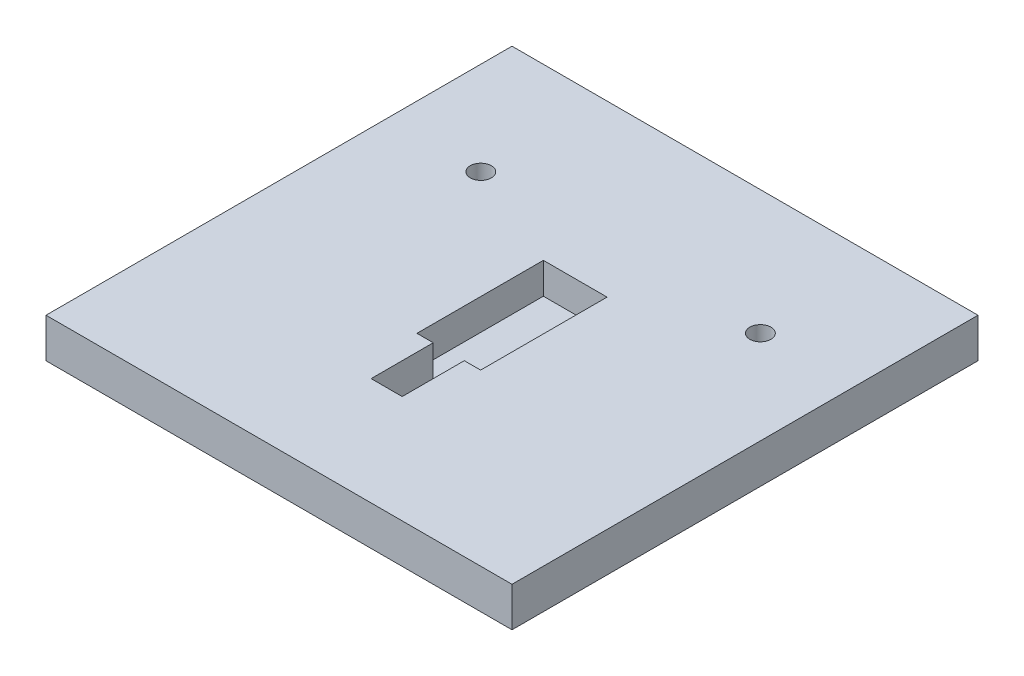
ISO-10303-21;
HEADER;
FILE_DESCRIPTION(('STEP AP214'),'2;1');
FILE_NAME('part.step','',(''),(''),'','','');
FILE_SCHEMA(('AUTOMOTIVE_DESIGN { 1 0 10303 214 1 1 1 1 }'));
ENDSEC;
DATA;
#1=APPLICATION_CONTEXT('core data for automotive mechanical design processes');
#2=APPLICATION_PROTOCOL_DEFINITION('international standard','automotive_design',2000,#1);
#3=PRODUCT_CONTEXT('',#1,'mechanical');
#4=PRODUCT('Part','Part','',(#3));
#5=PRODUCT_RELATED_PRODUCT_CATEGORY('part','',(#4));
#6=PRODUCT_DEFINITION_FORMATION('','',#4);
#7=PRODUCT_DEFINITION_CONTEXT('part definition',#1,'design');
#8=PRODUCT_DEFINITION('design','',#6,#7);
#9=PRODUCT_DEFINITION_SHAPE('','',#8);
#10=(LENGTH_UNIT() NAMED_UNIT(*) SI_UNIT(.MILLI.,.METRE.));
#11=(NAMED_UNIT(*) PLANE_ANGLE_UNIT() SI_UNIT($,.RADIAN.));
#12=(NAMED_UNIT(*) SI_UNIT($,.STERADIAN.) SOLID_ANGLE_UNIT());
#13=UNCERTAINTY_MEASURE_WITH_UNIT(LENGTH_MEASURE(1.E-05),#10,'distance_accuracy_value','');
#14=(GEOMETRIC_REPRESENTATION_CONTEXT(3) GLOBAL_UNCERTAINTY_ASSIGNED_CONTEXT((#13)) GLOBAL_UNIT_ASSIGNED_CONTEXT((#10,
#11,#12)) REPRESENTATION_CONTEXT('',''));
#15=CARTESIAN_POINT('',(0.,0.,0.));
#16=DIRECTION('',(0.,0.,1.));
#17=DIRECTION('',(1.,0.,0.));
#18=AXIS2_PLACEMENT_3D('',#15,#16,#17);
#19=CARTESIAN_POINT('',(-75.,12.7,75.));
#20=DIRECTION('',(1.,0.,0.));
#21=DIRECTION('',(0.,0.,-1.));
#22=AXIS2_PLACEMENT_3D('',#19,#20,#21);
#23=PLANE('',#22);
#24=DIRECTION('',(0.,0.,1.));
#25=VECTOR('',#24,1.);
#26=CARTESIAN_POINT('',(-75.,0.,75.));
#27=LINE('',#26,#25);
#28=CARTESIAN_POINT('',(-75.,0.,-75.));
#29=VERTEX_POINT('',#28);
#30=CARTESIAN_POINT('',(-75.,0.,75.));
#31=VERTEX_POINT('',#30);
#32=EDGE_CURVE('E250',#29,#31,#27,.T.);
#33=ORIENTED_EDGE('',*,*,#32,.T.);
#34=DIRECTION('',(0.,-1.,0.));
#35=VECTOR('',#34,1.);
#36=CARTESIAN_POINT('',(-75.,12.7,75.));
#37=LINE('',#36,#35);
#38=CARTESIAN_POINT('',(-75.,12.7,75.));
#39=VERTEX_POINT('',#38);
#40=EDGE_CURVE('E11',#39,#31,#37,.T.);
#41=ORIENTED_EDGE('',*,*,#40,.F.);
#42=DIRECTION('',(0.,0.,1.));
#43=VECTOR('',#42,1.);
#44=CARTESIAN_POINT('',(-75.,12.7,75.));
#45=LINE('',#44,#43);
#46=CARTESIAN_POINT('',(-75.,12.7,-75.));
#47=VERTEX_POINT('',#46);
#48=EDGE_CURVE('E265',#47,#39,#45,.T.);
#49=ORIENTED_EDGE('',*,*,#48,.F.);
#50=DIRECTION('',(0.,-1.,0.));
#51=VECTOR('',#50,1.);
#52=CARTESIAN_POINT('',(-75.,12.7,-75.));
#53=LINE('',#52,#51);
#54=EDGE_CURVE('E279',#47,#29,#53,.T.);
#55=ORIENTED_EDGE('',*,*,#54,.T.);
#56=EDGE_LOOP('',(#33,#41,#49,#55));
#57=FACE_BOUND('',#56,.T.);
#58=ADVANCED_FACE('F42',(#57),#23,.F.);
#59=CARTESIAN_POINT('',(75.,12.7,75.));
#60=DIRECTION('',(0.,0.,-1.));
#61=DIRECTION('',(-1.,0.,0.));
#62=AXIS2_PLACEMENT_3D('',#59,#60,#61);
#63=PLANE('',#62);
#64=DIRECTION('',(1.,0.,0.));
#65=VECTOR('',#64,1.);
#66=CARTESIAN_POINT('',(75.,0.,75.));
#67=LINE('',#66,#65);
#68=CARTESIAN_POINT('',(75.,0.,75.));
#69=VERTEX_POINT('',#68);
#70=EDGE_CURVE('E283',#31,#69,#67,.T.);
#71=ORIENTED_EDGE('',*,*,#70,.T.);
#72=DIRECTION('',(0.,-1.,0.));
#73=VECTOR('',#72,1.);
#74=CARTESIAN_POINT('',(75.,12.7,75.));
#75=LINE('',#74,#73);
#76=CARTESIAN_POINT('',(75.,12.7,75.));
#77=VERTEX_POINT('',#76);
#78=EDGE_CURVE('E50',#77,#69,#75,.T.);
#79=ORIENTED_EDGE('',*,*,#78,.F.);
#80=DIRECTION('',(1.,0.,0.));
#81=VECTOR('',#80,1.);
#82=CARTESIAN_POINT('',(75.,12.7,75.));
#83=LINE('',#82,#81);
#84=EDGE_CURVE('E269',#39,#77,#83,.T.);
#85=ORIENTED_EDGE('',*,*,#84,.F.);
#86=ORIENTED_EDGE('',*,*,#40,.T.);
#87=EDGE_LOOP('',(#71,#79,#85,#86));
#88=FACE_BOUND('',#87,.T.);
#89=ADVANCED_FACE('F317',(#88),#63,.F.);
#90=CARTESIAN_POINT('',(75.,12.7,75.));
#91=DIRECTION('',(-1.,0.,0.));
#92=DIRECTION('',(0.,0.,1.));
#93=AXIS2_PLACEMENT_3D('',#90,#91,#92);
#94=PLANE('',#93);
#95=DIRECTION('',(0.,0.,-1.));
#96=VECTOR('',#95,1.);
#97=CARTESIAN_POINT('',(75.,0.,75.));
#98=LINE('',#97,#96);
#99=CARTESIAN_POINT('',(75.,0.,-75.));
#100=VERTEX_POINT('',#99);
#101=EDGE_CURVE('E286',#69,#100,#98,.T.);
#102=ORIENTED_EDGE('',*,*,#101,.T.);
#103=DIRECTION('',(0.,-1.,0.));
#104=VECTOR('',#103,1.);
#105=CARTESIAN_POINT('',(75.,12.7,-75.));
#106=LINE('',#105,#104);
#107=CARTESIAN_POINT('',(75.,12.7,-75.));
#108=VERTEX_POINT('',#107);
#109=EDGE_CURVE('E294',#108,#100,#106,.T.);
#110=ORIENTED_EDGE('',*,*,#109,.F.);
#111=DIRECTION('',(0.,0.,-1.));
#112=VECTOR('',#111,1.);
#113=CARTESIAN_POINT('',(75.,12.7,75.));
#114=LINE('',#113,#112);
#115=EDGE_CURVE('E273',#77,#108,#114,.T.);
#116=ORIENTED_EDGE('',*,*,#115,.F.);
#117=ORIENTED_EDGE('',*,*,#78,.T.);
#118=EDGE_LOOP('',(#102,#110,#116,#117));
#119=FACE_BOUND('',#118,.T.);
#120=ADVANCED_FACE('F303',(#119),#94,.F.);
#121=CARTESIAN_POINT('',(75.,12.7,-75.));
#122=DIRECTION('',(0.,0.,1.));
#123=DIRECTION('',(1.,0.,0.));
#124=AXIS2_PLACEMENT_3D('',#121,#122,#123);
#125=PLANE('',#124);
#126=DIRECTION('',(-1.,0.,0.));
#127=VECTOR('',#126,1.);
#128=CARTESIAN_POINT('',(75.,0.,-75.));
#129=LINE('',#128,#127);
#130=EDGE_CURVE('E270',#100,#29,#129,.T.);
#131=ORIENTED_EDGE('',*,*,#130,.T.);
#132=ORIENTED_EDGE('',*,*,#54,.F.);
#133=DIRECTION('',(-1.,0.,0.));
#134=VECTOR('',#133,1.);
#135=CARTESIAN_POINT('',(75.,12.7,-75.));
#136=LINE('',#135,#134);
#137=EDGE_CURVE('E276',#108,#47,#136,.T.);
#138=ORIENTED_EDGE('',*,*,#137,.F.);
#139=ORIENTED_EDGE('',*,*,#109,.T.);
#140=EDGE_LOOP('',(#131,#132,#138,#139));
#141=FACE_BOUND('',#140,.T.);
#142=ADVANCED_FACE('F310',(#141),#125,.F.);
#143=CARTESIAN_POINT('',(0.,12.7,0.));
#144=DIRECTION('',(0.,1.,0.));
#145=DIRECTION('',(0.,0.,1.));
#146=AXIS2_PLACEMENT_3D('',#143,#144,#145);
#147=PLANE('',#146);
#148=CARTESIAN_POINT('',(45.,12.7,-34.96));
#149=DIRECTION('',(0.,1.,0.));
#150=DIRECTION('',(0.,0.,1.));
#151=AXIS2_PLACEMENT_3D('',#148,#149,#150);
#152=CIRCLE('',#151,3.39999999999999);
#153=CARTESIAN_POINT('',(45.,12.7,-31.56));
#154=VERTEX_POINT('',#153);
#155=EDGE_CURVE('E382',#154,#154,#152,.T.);
#156=ORIENTED_EDGE('',*,*,#155,.F.);
#157=EDGE_LOOP('',(#156));
#158=FACE_BOUND('',#157,.T.);
#159=CARTESIAN_POINT('',(-45.,12.7,-34.96));
#160=DIRECTION('',(0.,1.,0.));
#161=DIRECTION('',(0.,0.,1.));
#162=AXIS2_PLACEMENT_3D('',#159,#160,#161);
#163=CIRCLE('',#162,3.39999999999999);
#164=CARTESIAN_POINT('',(-45.,12.7,-31.56));
#165=VERTEX_POINT('',#164);
#166=EDGE_CURVE('E386',#165,#165,#163,.T.);
#167=ORIENTED_EDGE('',*,*,#166,.F.);
#168=EDGE_LOOP('',(#167));
#169=FACE_BOUND('',#168,.T.);
#170=DIRECTION('',(1.,0.,0.));
#171=VECTOR('',#170,1.);
#172=CARTESIAN_POINT('',(-5.,12.7,40.35));
#173=LINE('',#172,#171);
#174=CARTESIAN_POINT('',(-5.,12.7,40.35));
#175=VERTEX_POINT('',#174);
#176=CARTESIAN_POINT('',(5.,12.7,40.35));
#177=VERTEX_POINT('',#176);
#178=EDGE_CURVE('E170',#175,#177,#173,.T.);
#179=ORIENTED_EDGE('',*,*,#178,.F.);
#180=DIRECTION('',(0.,0.,1.));
#181=VECTOR('',#180,1.);
#182=CARTESIAN_POINT('',(-5.,12.7,20.35));
#183=LINE('',#182,#181);
#184=CARTESIAN_POINT('',(-5.,12.7,20.35));
#185=VERTEX_POINT('',#184);
#186=EDGE_CURVE('E152',#185,#175,#183,.T.);
#187=ORIENTED_EDGE('',*,*,#186,.F.);
#188=DIRECTION('',(1.,0.,0.));
#189=VECTOR('',#188,1.);
#190=CARTESIAN_POINT('',(-10.25,12.7,20.35));
#191=LINE('',#190,#189);
#192=CARTESIAN_POINT('',(-10.25,12.7,20.35));
#193=VERTEX_POINT('',#192);
#194=EDGE_CURVE('E226',#193,#185,#191,.T.);
#195=ORIENTED_EDGE('',*,*,#194,.F.);
#196=DIRECTION('',(0.,0.,1.));
#197=VECTOR('',#196,1.);
#198=CARTESIAN_POINT('',(-10.25,12.7,20.35));
#199=LINE('',#198,#197);
#200=CARTESIAN_POINT('',(-10.25,12.7,-20.35));
#201=VERTEX_POINT('',#200);
#202=EDGE_CURVE('E65',#201,#193,#199,.T.);
#203=ORIENTED_EDGE('',*,*,#202,.F.);
#204=DIRECTION('',(-1.,0.,0.));
#205=VECTOR('',#204,1.);
#206=CARTESIAN_POINT('',(10.25,12.7,-20.35));
#207=LINE('',#206,#205);
#208=CARTESIAN_POINT('',(10.25,12.7,-20.35));
#209=VERTEX_POINT('',#208);
#210=EDGE_CURVE('E195',#209,#201,#207,.T.);
#211=ORIENTED_EDGE('',*,*,#210,.F.);
#212=DIRECTION('',(0.,0.,-1.));
#213=VECTOR('',#212,1.);
#214=CARTESIAN_POINT('',(10.25,12.7,20.35));
#215=LINE('',#214,#213);
#216=CARTESIAN_POINT('',(10.25,12.7,20.35));
#217=VERTEX_POINT('',#216);
#218=EDGE_CURVE('E240',#217,#209,#215,.T.);
#219=ORIENTED_EDGE('',*,*,#218,.F.);
#220=DIRECTION('',(1.,0.,0.));
#221=VECTOR('',#220,1.);
#222=CARTESIAN_POINT('',(5.,12.7,20.35));
#223=LINE('',#222,#221);
#224=CARTESIAN_POINT('',(5.,12.7,20.35));
#225=VERTEX_POINT('',#224);
#226=EDGE_CURVE('E236',#225,#217,#223,.T.);
#227=ORIENTED_EDGE('',*,*,#226,.F.);
#228=DIRECTION('',(0.,0.,-1.));
#229=VECTOR('',#228,1.);
#230=CARTESIAN_POINT('',(5.,12.7,20.35));
#231=LINE('',#230,#229);
#232=EDGE_CURVE('E232',#177,#225,#231,.T.);
#233=ORIENTED_EDGE('',*,*,#232,.F.);
#234=EDGE_LOOP('',(#179,#187,#195,#203,#211,#219,#227,#233));
#235=FACE_BOUND('',#234,.T.);
#236=ORIENTED_EDGE('',*,*,#48,.T.);
#237=ORIENTED_EDGE('',*,*,#84,.T.);
#238=ORIENTED_EDGE('',*,*,#115,.T.);
#239=ORIENTED_EDGE('',*,*,#137,.T.);
#240=EDGE_LOOP('',(#236,#237,#238,#239));
#241=FACE_BOUND('',#240,.T.);
#242=ADVANCED_FACE('F316',(#158,#169,#235,#241),#147,.T.);
#243=CARTESIAN_POINT('',(0.,0.,0.));
#244=DIRECTION('',(0.,1.,0.));
#245=DIRECTION('',(0.,0.,1.));
#246=AXIS2_PLACEMENT_3D('',#243,#244,#245);
#247=PLANE('',#246);
#248=CARTESIAN_POINT('',(45.,0.,-34.96));
#249=DIRECTION('',(0.,1.,0.));
#250=DIRECTION('',(0.,0.,1.));
#251=AXIS2_PLACEMENT_3D('',#248,#249,#250);
#252=CIRCLE('',#251,3.39999999999999);
#253=CARTESIAN_POINT('',(45.,0.,-31.56));
#254=VERTEX_POINT('',#253);
#255=EDGE_CURVE('E379',#254,#254,#252,.T.);
#256=ORIENTED_EDGE('',*,*,#255,.T.);
#257=EDGE_LOOP('',(#256));
#258=FACE_BOUND('',#257,.T.);
#259=CARTESIAN_POINT('',(-45.,0.,-34.96));
#260=DIRECTION('',(0.,1.,0.));
#261=DIRECTION('',(0.,0.,1.));
#262=AXIS2_PLACEMENT_3D('',#259,#260,#261);
#263=CIRCLE('',#262,3.39999999999999);
#264=CARTESIAN_POINT('',(-45.,0.,-31.56));
#265=VERTEX_POINT('',#264);
#266=EDGE_CURVE('E173',#265,#265,#263,.T.);
#267=ORIENTED_EDGE('',*,*,#266,.T.);
#268=EDGE_LOOP('',(#267));
#269=FACE_BOUND('',#268,.T.);
#270=DIRECTION('',(-1.,0.,0.));
#271=VECTOR('',#270,1.);
#272=CARTESIAN_POINT('',(-5.,0.,30.35));
#273=LINE('',#272,#271);
#274=CARTESIAN_POINT('',(5.,0.,30.35));
#275=VERTEX_POINT('',#274);
#276=CARTESIAN_POINT('',(-5.,0.,30.35));
#277=VERTEX_POINT('',#276);
#278=EDGE_CURVE('E158',#275,#277,#273,.T.);
#279=ORIENTED_EDGE('',*,*,#278,.T.);
#280=DIRECTION('',(0.,0.,1.));
#281=VECTOR('',#280,1.);
#282=CARTESIAN_POINT('',(-5.,0.,30.35));
#283=LINE('',#282,#281);
#284=CARTESIAN_POINT('',(-5.,0.,40.35));
#285=VERTEX_POINT('',#284);
#286=EDGE_CURVE('E149',#277,#285,#283,.T.);
#287=ORIENTED_EDGE('',*,*,#286,.T.);
#288=DIRECTION('',(1.,0.,0.));
#289=VECTOR('',#288,1.);
#290=CARTESIAN_POINT('',(-5.,0.,40.35));
#291=LINE('',#290,#289);
#292=CARTESIAN_POINT('',(5.,0.,40.35));
#293=VERTEX_POINT('',#292);
#294=EDGE_CURVE('E161',#285,#293,#291,.T.);
#295=ORIENTED_EDGE('',*,*,#294,.T.);
#296=DIRECTION('',(0.,0.,-1.));
#297=VECTOR('',#296,1.);
#298=CARTESIAN_POINT('',(5.,0.,30.35));
#299=LINE('',#298,#297);
#300=EDGE_CURVE('E57',#293,#275,#299,.T.);
#301=ORIENTED_EDGE('',*,*,#300,.T.);
#302=EDGE_LOOP('',(#279,#287,#295,#301));
#303=FACE_BOUND('',#302,.T.);
#304=ORIENTED_EDGE('',*,*,#32,.F.);
#305=ORIENTED_EDGE('',*,*,#130,.F.);
#306=ORIENTED_EDGE('',*,*,#101,.F.);
#307=ORIENTED_EDGE('',*,*,#70,.F.);
#308=EDGE_LOOP('',(#304,#305,#306,#307));
#309=FACE_BOUND('',#308,.T.);
#310=ADVANCED_FACE('F166',(#258,#269,#303,#309),#247,.F.);
#311=CARTESIAN_POINT('',(-10.25,2.7,20.35));
#312=DIRECTION('',(-1.,0.,0.));
#313=DIRECTION('',(0.,0.,1.));
#314=AXIS2_PLACEMENT_3D('',#311,#312,#313);
#315=PLANE('',#314);
#316=ORIENTED_EDGE('',*,*,#202,.T.);
#317=DIRECTION('',(0.,1.,0.));
#318=VECTOR('',#317,1.);
#319=CARTESIAN_POINT('',(-10.25,2.7,20.35));
#320=LINE('',#319,#318);
#321=CARTESIAN_POINT('',(-10.25,2.7,20.35));
#322=VERTEX_POINT('',#321);
#323=EDGE_CURVE('E223',#322,#193,#320,.T.);
#324=ORIENTED_EDGE('',*,*,#323,.F.);
#325=DIRECTION('',(0.,0.,1.));
#326=VECTOR('',#325,1.);
#327=CARTESIAN_POINT('',(-10.25,2.7,20.35));
#328=LINE('',#327,#326);
#329=CARTESIAN_POINT('',(-10.25,2.7,-20.35));
#330=VERTEX_POINT('',#329);
#331=EDGE_CURVE('E190',#330,#322,#328,.T.);
#332=ORIENTED_EDGE('',*,*,#331,.F.);
#333=DIRECTION('',(0.,1.,0.));
#334=VECTOR('',#333,1.);
#335=CARTESIAN_POINT('',(-10.25,2.7,-20.35));
#336=LINE('',#335,#334);
#337=EDGE_CURVE('E247',#330,#201,#336,.T.);
#338=ORIENTED_EDGE('',*,*,#337,.T.);
#339=EDGE_LOOP('',(#316,#324,#332,#338));
#340=FACE_BOUND('',#339,.T.);
#341=ADVANCED_FACE('F329',(#340),#315,.F.);
#342=CARTESIAN_POINT('',(10.25,2.7,-20.35));
#343=DIRECTION('',(0.,0.,-1.));
#344=DIRECTION('',(-1.,0.,0.));
#345=AXIS2_PLACEMENT_3D('',#342,#343,#344);
#346=PLANE('',#345);
#347=ORIENTED_EDGE('',*,*,#210,.T.);
#348=ORIENTED_EDGE('',*,*,#337,.F.);
#349=DIRECTION('',(-1.,0.,0.));
#350=VECTOR('',#349,1.);
#351=CARTESIAN_POINT('',(10.25,2.7,-20.35));
#352=LINE('',#351,#350);
#353=CARTESIAN_POINT('',(10.25,2.7,-20.35));
#354=VERTEX_POINT('',#353);
#355=EDGE_CURVE('E219',#354,#330,#352,.T.);
#356=ORIENTED_EDGE('',*,*,#355,.F.);
#357=DIRECTION('',(0.,1.,0.));
#358=VECTOR('',#357,1.);
#359=CARTESIAN_POINT('',(10.25,2.7,-20.35));
#360=LINE('',#359,#358);
#361=EDGE_CURVE('E251',#354,#209,#360,.T.);
#362=ORIENTED_EDGE('',*,*,#361,.T.);
#363=EDGE_LOOP('',(#347,#348,#356,#362));
#364=FACE_BOUND('',#363,.T.);
#365=ADVANCED_FACE('F336',(#364),#346,.F.);
#366=CARTESIAN_POINT('',(10.25,2.7,20.35));
#367=DIRECTION('',(1.,0.,0.));
#368=DIRECTION('',(0.,0.,-1.));
#369=AXIS2_PLACEMENT_3D('',#366,#367,#368);
#370=PLANE('',#369);
#371=ORIENTED_EDGE('',*,*,#218,.T.);
#372=ORIENTED_EDGE('',*,*,#361,.F.);
#373=DIRECTION('',(0.,0.,-1.));
#374=VECTOR('',#373,1.);
#375=CARTESIAN_POINT('',(10.25,2.7,20.35));
#376=LINE('',#375,#374);
#377=CARTESIAN_POINT('',(10.25,2.7,20.35));
#378=VERTEX_POINT('',#377);
#379=EDGE_CURVE('E215',#378,#354,#376,.T.);
#380=ORIENTED_EDGE('',*,*,#379,.F.);
#381=DIRECTION('',(0.,1.,0.));
#382=VECTOR('',#381,1.);
#383=CARTESIAN_POINT('',(10.25,2.7,20.35));
#384=LINE('',#383,#382);
#385=EDGE_CURVE('E254',#378,#217,#384,.T.);
#386=ORIENTED_EDGE('',*,*,#385,.T.);
#387=EDGE_LOOP('',(#371,#372,#380,#386));
#388=FACE_BOUND('',#387,.T.);
#389=ADVANCED_FACE('F350',(#388),#370,.F.);
#390=CARTESIAN_POINT('',(5.,2.7,20.35));
#391=DIRECTION('',(0.,0.,1.));
#392=DIRECTION('',(1.,0.,0.));
#393=AXIS2_PLACEMENT_3D('',#390,#391,#392);
#394=PLANE('',#393);
#395=ORIENTED_EDGE('',*,*,#226,.T.);
#396=ORIENTED_EDGE('',*,*,#385,.F.);
#397=DIRECTION('',(1.,0.,0.));
#398=VECTOR('',#397,1.);
#399=CARTESIAN_POINT('',(5.,2.7,20.35));
#400=LINE('',#399,#398);
#401=CARTESIAN_POINT('',(5.,2.7,20.35));
#402=VERTEX_POINT('',#401);
#403=EDGE_CURVE('E211',#402,#378,#400,.T.);
#404=ORIENTED_EDGE('',*,*,#403,.F.);
#405=DIRECTION('',(0.,1.,0.));
#406=VECTOR('',#405,1.);
#407=CARTESIAN_POINT('',(5.,2.7,20.35));
#408=LINE('',#407,#406);
#409=EDGE_CURVE('E257',#402,#225,#408,.T.);
#410=ORIENTED_EDGE('',*,*,#409,.T.);
#411=EDGE_LOOP('',(#395,#396,#404,#410));
#412=FACE_BOUND('',#411,.T.);
#413=ADVANCED_FACE('F347',(#412),#394,.F.);
#414=CARTESIAN_POINT('',(5.,2.7,20.35));
#415=DIRECTION('',(1.,0.,0.));
#416=DIRECTION('',(0.,0.,-1.));
#417=AXIS2_PLACEMENT_3D('',#414,#415,#416);
#418=PLANE('',#417);
#419=ORIENTED_EDGE('',*,*,#232,.T.);
#420=ORIENTED_EDGE('',*,*,#409,.F.);
#421=DIRECTION('',(0.,0.,-1.));
#422=VECTOR('',#421,1.);
#423=CARTESIAN_POINT('',(5.,2.7,20.35));
#424=LINE('',#423,#422);
#425=CARTESIAN_POINT('',(5.,2.7,30.35));
#426=VERTEX_POINT('',#425);
#427=EDGE_CURVE('E207',#426,#402,#424,.T.);
#428=ORIENTED_EDGE('',*,*,#427,.F.);
#429=DIRECTION('',(0.,1.,0.));
#430=VECTOR('',#429,1.);
#431=CARTESIAN_POINT('',(5.,0.,30.35));
#432=LINE('',#431,#430);
#433=EDGE_CURVE('E185',#275,#426,#432,.T.);
#434=ORIENTED_EDGE('',*,*,#433,.F.);
#435=ORIENTED_EDGE('',*,*,#300,.F.);
#436=DIRECTION('',(0.,1.,0.));
#437=VECTOR('',#436,1.);
#438=CARTESIAN_POINT('',(5.,0.,40.35));
#439=LINE('',#438,#437);
#440=EDGE_CURVE('E157',#293,#177,#439,.T.);
#441=ORIENTED_EDGE('',*,*,#440,.T.);
#442=EDGE_LOOP('',(#419,#420,#428,#434,#435,#441));
#443=FACE_BOUND('',#442,.T.);
#444=ADVANCED_FACE('F344',(#443),#418,.F.);
#445=CARTESIAN_POINT('',(-5.,2.7,20.35));
#446=DIRECTION('',(-1.,0.,0.));
#447=DIRECTION('',(0.,0.,1.));
#448=AXIS2_PLACEMENT_3D('',#445,#446,#447);
#449=PLANE('',#448);
#450=ORIENTED_EDGE('',*,*,#186,.T.);
#451=DIRECTION('',(0.,1.,0.));
#452=VECTOR('',#451,1.);
#453=CARTESIAN_POINT('',(-5.,0.,40.35));
#454=LINE('',#453,#452);
#455=EDGE_CURVE('E144',#285,#175,#454,.T.);
#456=ORIENTED_EDGE('',*,*,#455,.F.);
#457=ORIENTED_EDGE('',*,*,#286,.F.);
#458=DIRECTION('',(0.,1.,0.));
#459=VECTOR('',#458,1.);
#460=CARTESIAN_POINT('',(-5.,0.,30.35));
#461=LINE('',#460,#459);
#462=CARTESIAN_POINT('',(-5.,2.7,30.35));
#463=VERTEX_POINT('',#462);
#464=EDGE_CURVE('E182',#277,#463,#461,.T.);
#465=ORIENTED_EDGE('',*,*,#464,.T.);
#466=DIRECTION('',(0.,0.,1.));
#467=VECTOR('',#466,1.);
#468=CARTESIAN_POINT('',(-5.,2.7,20.35));
#469=LINE('',#468,#467);
#470=CARTESIAN_POINT('',(-5.,2.7,20.35));
#471=VERTEX_POINT('',#470);
#472=EDGE_CURVE('E199',#471,#463,#469,.T.);
#473=ORIENTED_EDGE('',*,*,#472,.F.);
#474=DIRECTION('',(0.,1.,0.));
#475=VECTOR('',#474,1.);
#476=CARTESIAN_POINT('',(-5.,2.7,20.35));
#477=LINE('',#476,#475);
#478=EDGE_CURVE('E260',#471,#185,#477,.T.);
#479=ORIENTED_EDGE('',*,*,#478,.T.);
#480=EDGE_LOOP('',(#450,#456,#457,#465,#473,#479));
#481=FACE_BOUND('',#480,.T.);
#482=ADVANCED_FACE('F146',(#481),#449,.F.);
#483=CARTESIAN_POINT('',(-10.25,2.7,20.35));
#484=DIRECTION('',(0.,0.,1.));
#485=DIRECTION('',(1.,0.,0.));
#486=AXIS2_PLACEMENT_3D('',#483,#484,#485);
#487=PLANE('',#486);
#488=ORIENTED_EDGE('',*,*,#194,.T.);
#489=ORIENTED_EDGE('',*,*,#478,.F.);
#490=DIRECTION('',(1.,0.,0.));
#491=VECTOR('',#490,1.);
#492=CARTESIAN_POINT('',(-10.25,2.7,20.35));
#493=LINE('',#492,#491);
#494=EDGE_CURVE('E194',#322,#471,#493,.T.);
#495=ORIENTED_EDGE('',*,*,#494,.F.);
#496=ORIENTED_EDGE('',*,*,#323,.T.);
#497=EDGE_LOOP('',(#488,#489,#495,#496));
#498=FACE_BOUND('',#497,.T.);
#499=ADVANCED_FACE('F337',(#498),#487,.F.);
#500=CARTESIAN_POINT('',(0.,2.7,0.));
#501=DIRECTION('',(0.,1.,0.));
#502=DIRECTION('',(0.,0.,1.));
#503=AXIS2_PLACEMENT_3D('',#500,#501,#502);
#504=PLANE('',#503);
#505=ORIENTED_EDGE('',*,*,#331,.T.);
#506=ORIENTED_EDGE('',*,*,#494,.T.);
#507=ORIENTED_EDGE('',*,*,#472,.T.);
#508=DIRECTION('',(1.,0.,0.));
#509=VECTOR('',#508,1.);
#510=CARTESIAN_POINT('',(-5.,2.7,30.35));
#511=LINE('',#510,#509);
#512=EDGE_CURVE('E203',#463,#426,#511,.T.);
#513=ORIENTED_EDGE('',*,*,#512,.T.);
#514=ORIENTED_EDGE('',*,*,#427,.T.);
#515=ORIENTED_EDGE('',*,*,#403,.T.);
#516=ORIENTED_EDGE('',*,*,#379,.T.);
#517=ORIENTED_EDGE('',*,*,#355,.T.);
#518=EDGE_LOOP('',(#505,#506,#507,#513,#514,#515,#516,#517));
#519=FACE_BOUND('',#518,.T.);
#520=ADVANCED_FACE('F340',(#519),#504,.T.);
#521=CARTESIAN_POINT('',(-5.,0.,30.35));
#522=DIRECTION('',(0.,0.,-1.));
#523=DIRECTION('',(-1.,0.,0.));
#524=AXIS2_PLACEMENT_3D('',#521,#522,#523);
#525=PLANE('',#524);
#526=ORIENTED_EDGE('',*,*,#512,.F.);
#527=ORIENTED_EDGE('',*,*,#464,.F.);
#528=ORIENTED_EDGE('',*,*,#278,.F.);
#529=ORIENTED_EDGE('',*,*,#433,.T.);
#530=EDGE_LOOP('',(#526,#527,#528,#529));
#531=FACE_BOUND('',#530,.T.);
#532=ADVANCED_FACE('F360',(#531),#525,.F.);
#533=CARTESIAN_POINT('',(-5.,0.,40.35));
#534=DIRECTION('',(0.,0.,1.));
#535=DIRECTION('',(1.,0.,0.));
#536=AXIS2_PLACEMENT_3D('',#533,#534,#535);
#537=PLANE('',#536);
#538=ORIENTED_EDGE('',*,*,#178,.T.);
#539=ORIENTED_EDGE('',*,*,#440,.F.);
#540=ORIENTED_EDGE('',*,*,#294,.F.);
#541=ORIENTED_EDGE('',*,*,#455,.T.);
#542=EDGE_LOOP('',(#538,#539,#540,#541));
#543=FACE_BOUND('',#542,.T.);
#544=ADVANCED_FACE('F162',(#543),#537,.F.);
#545=CARTESIAN_POINT('',(-45.,12.7,-34.96));
#546=DIRECTION('',(0.,1.,0.));
#547=DIRECTION('',(0.,0.,1.));
#548=AXIS2_PLACEMENT_3D('',#545,#546,#547);
#549=CYLINDRICAL_SURFACE('',#548,3.39999999999999);
#550=ORIENTED_EDGE('',*,*,#266,.F.);
#551=EDGE_LOOP('',(#550));
#552=FACE_BOUND('',#551,.T.);
#553=ORIENTED_EDGE('',*,*,#166,.T.);
#554=EDGE_LOOP('',(#553));
#555=FACE_BOUND('',#554,.T.);
#556=ADVANCED_FACE('F364',(#552,#555),#549,.F.);
#557=CARTESIAN_POINT('',(45.,12.7,-34.96));
#558=DIRECTION('',(0.,1.,0.));
#559=DIRECTION('',(0.,0.,1.));
#560=AXIS2_PLACEMENT_3D('',#557,#558,#559);
#561=CYLINDRICAL_SURFACE('',#560,3.39999999999999);
#562=ORIENTED_EDGE('',*,*,#255,.F.);
#563=EDGE_LOOP('',(#562));
#564=FACE_BOUND('',#563,.T.);
#565=ORIENTED_EDGE('',*,*,#155,.T.);
#566=EDGE_LOOP('',(#565));
#567=FACE_BOUND('',#566,.T.);
#568=ADVANCED_FACE('F370',(#564,#567),#561,.F.);
#569=CLOSED_SHELL('',(#58,#89,#120,#142,#242,#310,#341,#365,#389,#413,#444,#482,#499,#520,#532,
#544,#556,#568));
#570=MANIFOLD_SOLID_BREP('B2',#569);
#571=ADVANCED_BREP_SHAPE_REPRESENTATION('',(#18,#570),#14);
#572=SHAPE_DEFINITION_REPRESENTATION(#9,#571);
ENDSEC;
END-ISO-10303-21;
